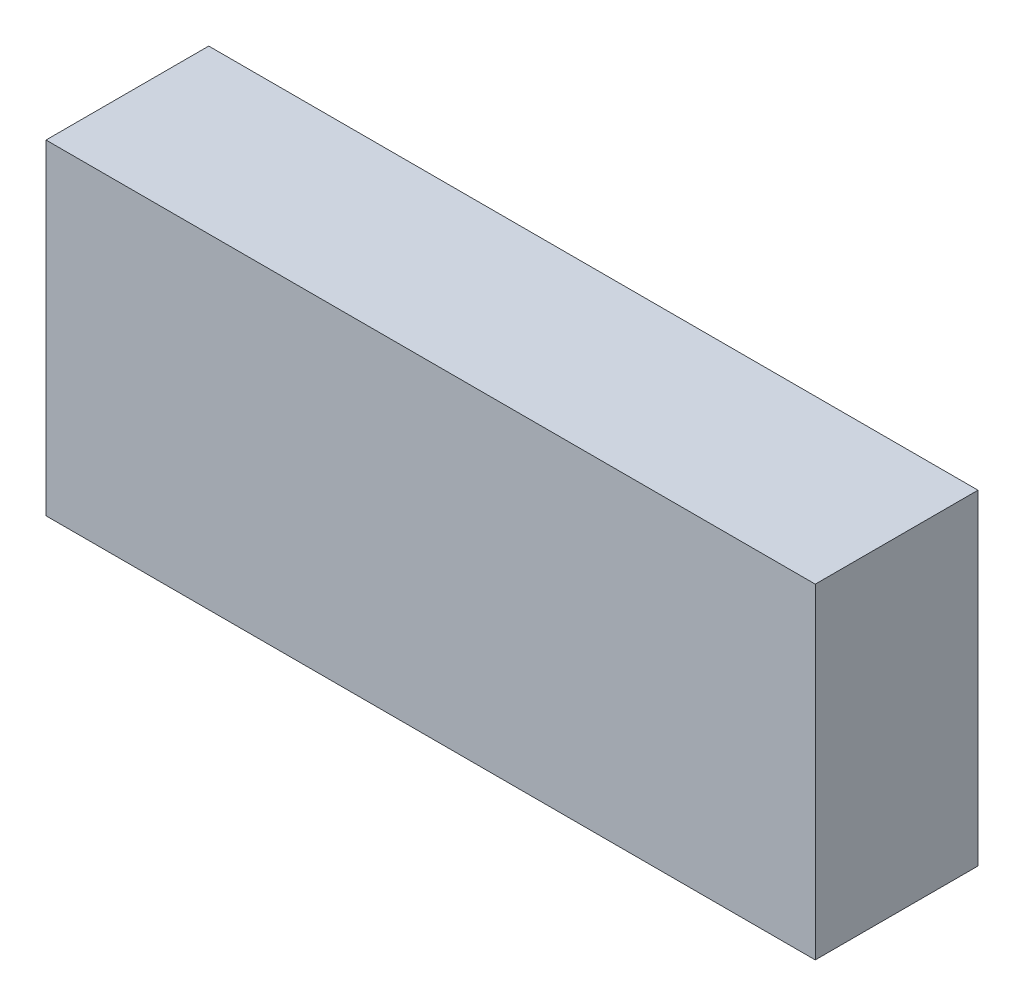
ISO-10303-21;
HEADER;
FILE_DESCRIPTION(('STEP AP214'),'2;1');
FILE_NAME('part.step','',(''),(''),'','','');
FILE_SCHEMA(('AUTOMOTIVE_DESIGN { 1 0 10303 214 1 1 1 1 }'));
ENDSEC;
DATA;
#1=APPLICATION_CONTEXT('core data for automotive mechanical design processes');
#2=APPLICATION_PROTOCOL_DEFINITION('international standard','automotive_design',2000,#1);
#3=PRODUCT_CONTEXT('',#1,'mechanical');
#4=PRODUCT('Part','Part','',(#3));
#5=PRODUCT_RELATED_PRODUCT_CATEGORY('part','',(#4));
#6=PRODUCT_DEFINITION_FORMATION('','',#4);
#7=PRODUCT_DEFINITION_CONTEXT('part definition',#1,'design');
#8=PRODUCT_DEFINITION('design','',#6,#7);
#9=PRODUCT_DEFINITION_SHAPE('','',#8);
#10=(LENGTH_UNIT() NAMED_UNIT(*) SI_UNIT(.MILLI.,.METRE.));
#11=(NAMED_UNIT(*) PLANE_ANGLE_UNIT() SI_UNIT($,.RADIAN.));
#12=(NAMED_UNIT(*) SI_UNIT($,.STERADIAN.) SOLID_ANGLE_UNIT());
#13=UNCERTAINTY_MEASURE_WITH_UNIT(LENGTH_MEASURE(1.E-05),#10,'distance_accuracy_value','');
#14=(GEOMETRIC_REPRESENTATION_CONTEXT(3) GLOBAL_UNCERTAINTY_ASSIGNED_CONTEXT((#13)) GLOBAL_UNIT_ASSIGNED_CONTEXT((#10,
#11,#12)) REPRESENTATION_CONTEXT('',''));
#15=CARTESIAN_POINT('',(0.,0.,0.));
#16=DIRECTION('',(0.,0.,1.));
#17=DIRECTION('',(1.,0.,0.));
#18=AXIS2_PLACEMENT_3D('',#15,#16,#17);
#19=CARTESIAN_POINT('',(1.29999994,-0.5499989,0.5499989));
#20=DIRECTION('',(0.,0.,1.));
#21=DIRECTION('',(1.,0.,0.));
#22=AXIS2_PLACEMENT_3D('',#19,#20,#21);
#23=PLANE('',#22);
#24=DIRECTION('',(0.,-1.,0.));
#25=VECTOR('',#24,1.);
#26=CARTESIAN_POINT('',(1.29999994,0.55000144,0.5499989));
#27=LINE('',#26,#25);
#28=CARTESIAN_POINT('',(1.29999994,0.55000144,0.5499989));
#29=VERTEX_POINT('',#28);
#30=CARTESIAN_POINT('',(1.29999994,-0.5499989,0.5499989));
#31=VERTEX_POINT('',#30);
#32=EDGE_CURVE('E25',#29,#31,#27,.T.);
#33=ORIENTED_EDGE('',*,*,#32,.F.);
#34=DIRECTION('',(1.,0.,0.));
#35=VECTOR('',#34,1.);
#36=CARTESIAN_POINT('',(-1.29999994,0.55000144,0.5499989));
#37=LINE('',#36,#35);
#38=CARTESIAN_POINT('',(-1.29999994,0.55000144,0.5499989));
#39=VERTEX_POINT('',#38);
#40=EDGE_CURVE('E67',#39,#29,#37,.T.);
#41=ORIENTED_EDGE('',*,*,#40,.F.);
#42=DIRECTION('',(0.,1.,0.));
#43=VECTOR('',#42,1.);
#44=CARTESIAN_POINT('',(-1.29999994,-0.5499989,0.5499989));
#45=LINE('',#44,#43);
#46=CARTESIAN_POINT('',(-1.29999994,-0.5499989,0.5499989));
#47=VERTEX_POINT('',#46);
#48=EDGE_CURVE('E70',#47,#39,#45,.T.);
#49=ORIENTED_EDGE('',*,*,#48,.F.);
#50=DIRECTION('',(-1.,0.,0.));
#51=VECTOR('',#50,1.);
#52=CARTESIAN_POINT('',(1.29999994,-0.5499989,0.5499989));
#53=LINE('',#52,#51);
#54=EDGE_CURVE('E112',#31,#47,#53,.T.);
#55=ORIENTED_EDGE('',*,*,#54,.F.);
#56=EDGE_LOOP('',(#33,#41,#49,#55));
#57=FACE_BOUND('',#56,.T.);
#58=ADVANCED_FACE('F17',(#57),#23,.T.);
#59=CARTESIAN_POINT('',(1.29999994,-0.5499989,0.));
#60=DIRECTION('',(0.,0.,1.));
#61=DIRECTION('',(1.,0.,0.));
#62=AXIS2_PLACEMENT_3D('',#59,#60,#61);
#63=PLANE('',#62);
#64=DIRECTION('',(-1.,0.,0.));
#65=VECTOR('',#64,1.);
#66=CARTESIAN_POINT('',(1.29999994,-0.5499989,0.));
#67=LINE('',#66,#65);
#68=CARTESIAN_POINT('',(1.29999994,-0.5499989,0.));
#69=VERTEX_POINT('',#68);
#70=CARTESIAN_POINT('',(-1.29999994,-0.5499989,0.));
#71=VERTEX_POINT('',#70);
#72=EDGE_CURVE('E91',#69,#71,#67,.T.);
#73=ORIENTED_EDGE('',*,*,#72,.T.);
#74=DIRECTION('',(0.,1.,0.));
#75=VECTOR('',#74,1.);
#76=CARTESIAN_POINT('',(-1.29999994,-0.5499989,0.));
#77=LINE('',#76,#75);
#78=CARTESIAN_POINT('',(-1.29999994,0.55000144,0.));
#79=VERTEX_POINT('',#78);
#80=EDGE_CURVE('E76',#71,#79,#77,.T.);
#81=ORIENTED_EDGE('',*,*,#80,.T.);
#82=DIRECTION('',(1.,0.,0.));
#83=VECTOR('',#82,1.);
#84=CARTESIAN_POINT('',(-1.29999994,0.55000144,0.));
#85=LINE('',#84,#83);
#86=CARTESIAN_POINT('',(1.29999994,0.55000144,0.));
#87=VERTEX_POINT('',#86);
#88=EDGE_CURVE('E81',#79,#87,#85,.T.);
#89=ORIENTED_EDGE('',*,*,#88,.T.);
#90=DIRECTION('',(0.,-1.,0.));
#91=VECTOR('',#90,1.);
#92=CARTESIAN_POINT('',(1.29999994,0.55000144,0.));
#93=LINE('',#92,#91);
#94=EDGE_CURVE('E11',#87,#69,#93,.T.);
#95=ORIENTED_EDGE('',*,*,#94,.T.);
#96=EDGE_LOOP('',(#73,#81,#89,#95));
#97=FACE_BOUND('',#96,.T.);
#98=ADVANCED_FACE('F162',(#97),#63,.F.);
#99=CARTESIAN_POINT('',(1.29999994,0.55000144,0.));
#100=DIRECTION('',(1.,0.,0.));
#101=DIRECTION('',(0.,1.,0.));
#102=AXIS2_PLACEMENT_3D('',#99,#100,#101);
#103=PLANE('',#102);
#104=DIRECTION('',(0.,0.,1.));
#105=VECTOR('',#104,1.);
#106=CARTESIAN_POINT('',(1.29999994,0.55000144,0.));
#107=LINE('',#106,#105);
#108=EDGE_CURVE('E75',#87,#29,#107,.T.);
#109=ORIENTED_EDGE('',*,*,#108,.T.);
#110=ORIENTED_EDGE('',*,*,#32,.T.);
#111=DIRECTION('',(0.,0.,1.));
#112=VECTOR('',#111,1.);
#113=CARTESIAN_POINT('',(1.29999994,-0.5499989,0.));
#114=LINE('',#113,#112);
#115=EDGE_CURVE('E115',#69,#31,#114,.T.);
#116=ORIENTED_EDGE('',*,*,#115,.F.);
#117=ORIENTED_EDGE('',*,*,#94,.F.);
#118=EDGE_LOOP('',(#109,#110,#116,#117));
#119=FACE_BOUND('',#118,.T.);
#120=ADVANCED_FACE('F167',(#119),#103,.T.);
#121=CARTESIAN_POINT('',(-1.29999994,0.55000144,0.));
#122=DIRECTION('',(0.,1.,0.));
#123=DIRECTION('',(1.,0.,0.));
#124=AXIS2_PLACEMENT_3D('',#121,#122,#123);
#125=PLANE('',#124);
#126=DIRECTION('',(0.,0.,1.));
#127=VECTOR('',#126,1.);
#128=CARTESIAN_POINT('',(-1.29999994,0.55000144,0.));
#129=LINE('',#128,#127);
#130=EDGE_CURVE('E79',#79,#39,#129,.T.);
#131=ORIENTED_EDGE('',*,*,#130,.T.);
#132=ORIENTED_EDGE('',*,*,#40,.T.);
#133=ORIENTED_EDGE('',*,*,#108,.F.);
#134=ORIENTED_EDGE('',*,*,#88,.F.);
#135=EDGE_LOOP('',(#131,#132,#133,#134));
#136=FACE_BOUND('',#135,.T.);
#137=ADVANCED_FACE('F80',(#136),#125,.T.);
#138=CARTESIAN_POINT('',(-1.29999994,-0.5499989,0.));
#139=DIRECTION('',(-1.,0.,0.));
#140=DIRECTION('',(0.,0.,1.));
#141=AXIS2_PLACEMENT_3D('',#138,#139,#140);
#142=PLANE('',#141);
#143=DIRECTION('',(0.,0.,1.));
#144=VECTOR('',#143,1.);
#145=CARTESIAN_POINT('',(-1.29999994,-0.5499989,0.));
#146=LINE('',#145,#144);
#147=EDGE_CURVE('E88',#71,#47,#146,.T.);
#148=ORIENTED_EDGE('',*,*,#147,.T.);
#149=ORIENTED_EDGE('',*,*,#48,.T.);
#150=ORIENTED_EDGE('',*,*,#130,.F.);
#151=ORIENTED_EDGE('',*,*,#80,.F.);
#152=EDGE_LOOP('',(#148,#149,#150,#151));
#153=FACE_BOUND('',#152,.T.);
#154=ADVANCED_FACE('F86',(#153),#142,.T.);
#155=CARTESIAN_POINT('',(1.29999994,-0.5499989,0.));
#156=DIRECTION('',(0.,-1.,0.));
#157=DIRECTION('',(0.,0.,-1.));
#158=AXIS2_PLACEMENT_3D('',#155,#156,#157);
#159=PLANE('',#158);
#160=ORIENTED_EDGE('',*,*,#115,.T.);
#161=ORIENTED_EDGE('',*,*,#54,.T.);
#162=ORIENTED_EDGE('',*,*,#147,.F.);
#163=ORIENTED_EDGE('',*,*,#72,.F.);
#164=EDGE_LOOP('',(#160,#161,#162,#163));
#165=FACE_BOUND('',#164,.T.);
#166=ADVANCED_FACE('F153',(#165),#159,.T.);
#167=CLOSED_SHELL('',(#58,#98,#120,#137,#154,#166));
#168=MANIFOLD_SOLID_BREP('B1',#167);
#169=ADVANCED_BREP_SHAPE_REPRESENTATION('',(#18,#168),#14);
#170=SHAPE_DEFINITION_REPRESENTATION(#9,#169);
ENDSEC;
END-ISO-10303-21;
